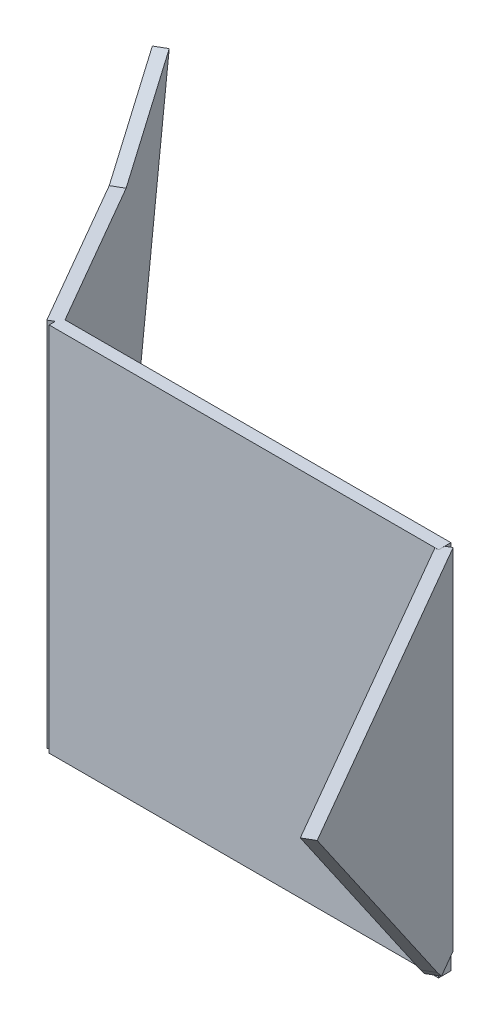
ISO-10303-21;
HEADER;
FILE_DESCRIPTION(('STEP AP214'),'2;1');
FILE_NAME('part.step','',(''),(''),'','','');
FILE_SCHEMA(('AUTOMOTIVE_DESIGN { 1 0 10303 214 1 1 1 1 }'));
ENDSEC;
DATA;
#1=APPLICATION_CONTEXT('core data for automotive mechanical design processes');
#2=APPLICATION_PROTOCOL_DEFINITION('international standard','automotive_design',2000,#1);
#3=PRODUCT_CONTEXT('',#1,'mechanical');
#4=PRODUCT('Part','Part','',(#3));
#5=PRODUCT_RELATED_PRODUCT_CATEGORY('part','',(#4));
#6=PRODUCT_DEFINITION_FORMATION('','',#4);
#7=PRODUCT_DEFINITION_CONTEXT('part definition',#1,'design');
#8=PRODUCT_DEFINITION('design','',#6,#7);
#9=PRODUCT_DEFINITION_SHAPE('','',#8);
#10=(LENGTH_UNIT() NAMED_UNIT(*) SI_UNIT(.MILLI.,.METRE.));
#11=(NAMED_UNIT(*) PLANE_ANGLE_UNIT() SI_UNIT($,.RADIAN.));
#12=(NAMED_UNIT(*) SI_UNIT($,.STERADIAN.) SOLID_ANGLE_UNIT());
#13=UNCERTAINTY_MEASURE_WITH_UNIT(LENGTH_MEASURE(1.E-05),#10,'distance_accuracy_value','');
#14=(GEOMETRIC_REPRESENTATION_CONTEXT(3) GLOBAL_UNCERTAINTY_ASSIGNED_CONTEXT((#13)) GLOBAL_UNIT_ASSIGNED_CONTEXT((#10,
#11,#12)) REPRESENTATION_CONTEXT('',''));
#15=CARTESIAN_POINT('',(0.,0.,0.));
#16=DIRECTION('',(0.,0.,1.));
#17=DIRECTION('',(1.,0.,0.));
#18=AXIS2_PLACEMENT_3D('',#15,#16,#17);
#19=CARTESIAN_POINT('',(-31.5,-30.,1.));
#20=DIRECTION('',(1.,0.,0.));
#21=DIRECTION('',(0.,0.,-1.));
#22=AXIS2_PLACEMENT_3D('',#19,#20,#21);
#23=PLANE('',#22);
#24=DIRECTION('',(0.,-0.361765106228722,0.932269278650391));
#25=VECTOR('',#24,1.);
#26=CARTESIAN_POINT('',(-31.5,-30.3372624946247,0.869126007915318));
#27=LINE('',#26,#25);
#28=CARTESIAN_POINT('',(-31.5,-29.6119521317356,-1.));
#29=VERTEX_POINT('',#28);
#30=CARTESIAN_POINT('',(-31.5,-30.,0.));
#31=VERTEX_POINT('',#30);
#32=EDGE_CURVE('E193',#29,#31,#27,.T.);
#33=ORIENTED_EDGE('',*,*,#32,.F.);
#34=DIRECTION('',(0.,-1.,0.));
#35=VECTOR('',#34,1.);
#36=CARTESIAN_POINT('',(-31.5,-30.,-1.));
#37=LINE('',#36,#35);
#38=CARTESIAN_POINT('',(-31.5,-30.,-1.));
#39=VERTEX_POINT('',#38);
#40=EDGE_CURVE('E285',#29,#39,#37,.T.);
#41=ORIENTED_EDGE('',*,*,#40,.T.);
#42=DIRECTION('',(0.,0.,-1.));
#43=VECTOR('',#42,1.);
#44=CARTESIAN_POINT('',(-31.5,-30.,1.));
#45=LINE('',#44,#43);
#46=EDGE_CURVE('E295',#31,#39,#45,.T.);
#47=ORIENTED_EDGE('',*,*,#46,.F.);
#48=EDGE_LOOP('',(#33,#41,#47));
#49=FACE_BOUND('',#48,.T.);
#50=ADVANCED_FACE('F47',(#49),#23,.F.);
#51=DIRECTION('',(0.,1.,0.));
#52=VECTOR('',#51,1.);
#53=CARTESIAN_POINT('',(-31.5,-30.,0.));
#54=LINE('',#53,#52);
#55=CARTESIAN_POINT('',(-31.5,30.,0.));
#56=VERTEX_POINT('',#55);
#57=EDGE_CURVE('E67',#31,#56,#54,.T.);
#58=ORIENTED_EDGE('',*,*,#57,.F.);
#59=CARTESIAN_POINT('',(-31.5,-30.,1.));
#60=VERTEX_POINT('',#59);
#61=EDGE_CURVE('E296',#60,#31,#45,.T.);
#62=ORIENTED_EDGE('',*,*,#61,.F.);
#63=DIRECTION('',(0.,-1.,0.));
#64=VECTOR('',#63,1.);
#65=CARTESIAN_POINT('',(-31.5,-30.,1.));
#66=LINE('',#65,#64);
#67=CARTESIAN_POINT('',(-31.5,30.,1.));
#68=VERTEX_POINT('',#67);
#69=EDGE_CURVE('E271',#68,#60,#66,.T.);
#70=ORIENTED_EDGE('',*,*,#69,.F.);
#71=DIRECTION('',(0.,0.,-1.));
#72=VECTOR('',#71,1.);
#73=CARTESIAN_POINT('',(-31.5,30.,1.));
#74=LINE('',#73,#72);
#75=EDGE_CURVE('E63',#68,#56,#74,.T.);
#76=ORIENTED_EDGE('',*,*,#75,.T.);
#77=EDGE_LOOP('',(#58,#62,#70,#76));
#78=FACE_BOUND('',#77,.T.);
#79=ADVANCED_FACE('F384',(#78),#23,.F.);
#80=CARTESIAN_POINT('',(0.,0.,-1.));
#81=DIRECTION('',(0.,0.,-1.));
#82=DIRECTION('',(-1.,0.,0.));
#83=AXIS2_PLACEMENT_3D('',#80,#81,#82);
#84=PLANE('',#83);
#85=ORIENTED_EDGE('',*,*,#40,.F.);
#86=DIRECTION('',(0.975810062793616,-0.218620038767537,0.));
#87=VECTOR('',#86,1.);
#88=CARTESIAN_POINT('',(-7.82269984956542,-34.9166035943157,-1.));
#89=LINE('',#88,#87);
#90=CARTESIAN_POINT('',(-30.9226497308104,-29.741301421157,-0.999999999999999));
#91=VERTEX_POINT('',#90);
#92=EDGE_CURVE('E11',#29,#91,#89,.T.);
#93=ORIENTED_EDGE('',*,*,#92,.T.);
#94=DIRECTION('',(0.,-1.,0.));
#95=VECTOR('',#94,1.);
#96=CARTESIAN_POINT('',(-30.9226497308104,0.,-1.));
#97=LINE('',#96,#95);
#98=CARTESIAN_POINT('',(-30.9226497308104,30.,-1.));
#99=VERTEX_POINT('',#98);
#100=EDGE_CURVE('E56',#99,#91,#97,.T.);
#101=ORIENTED_EDGE('',*,*,#100,.F.);
#102=DIRECTION('',(-1.,0.,0.));
#103=VECTOR('',#102,1.);
#104=CARTESIAN_POINT('',(-31.5,30.,-1.));
#105=LINE('',#104,#103);
#106=CARTESIAN_POINT('',(31.5,30.,-1.));
#107=VERTEX_POINT('',#106);
#108=EDGE_CURVE('E281',#107,#99,#105,.T.);
#109=ORIENTED_EDGE('',*,*,#108,.F.);
#110=DIRECTION('',(0.,1.,0.));
#111=VECTOR('',#110,1.);
#112=CARTESIAN_POINT('',(31.5,-30.,-1.));
#113=LINE('',#112,#111);
#114=CARTESIAN_POINT('',(31.5,-30.,-1.));
#115=VERTEX_POINT('',#114);
#116=EDGE_CURVE('E262',#115,#107,#113,.T.);
#117=ORIENTED_EDGE('',*,*,#116,.F.);
#118=DIRECTION('',(1.,0.,0.));
#119=VECTOR('',#118,1.);
#120=CARTESIAN_POINT('',(-31.5,-30.,-1.));
#121=LINE('',#120,#119);
#122=EDGE_CURVE('E289',#39,#115,#121,.T.);
#123=ORIENTED_EDGE('',*,*,#122,.F.);
#124=EDGE_LOOP('',(#85,#93,#101,#109,#117,#123));
#125=FACE_BOUND('',#124,.T.);
#126=ADVANCED_FACE('F340',(#125),#84,.T.);
#127=CARTESIAN_POINT('',(31.5,-30.,1.));
#128=DIRECTION('',(-1.,0.,0.));
#129=DIRECTION('',(0.,0.,1.));
#130=AXIS2_PLACEMENT_3D('',#127,#128,#129);
#131=PLANE('',#130);
#132=DIRECTION('',(0.,1.,0.));
#133=VECTOR('',#132,1.);
#134=CARTESIAN_POINT('',(31.5,-30.,0.));
#135=LINE('',#134,#133);
#136=CARTESIAN_POINT('',(31.5,-26.5343810519077,0.));
#137=VERTEX_POINT('',#136);
#138=CARTESIAN_POINT('',(31.5,29.9956189480923,0.));
#139=VERTEX_POINT('',#138);
#140=EDGE_CURVE('E318',#137,#139,#135,.T.);
#141=ORIENTED_EDGE('',*,*,#140,.F.);
#142=DIRECTION('',(0.,0.,1.));
#143=VECTOR('',#142,1.);
#144=CARTESIAN_POINT('',(31.5,-26.5343810519077,1.));
#145=LINE('',#144,#143);
#146=CARTESIAN_POINT('',(31.5,-26.5343810519077,1.));
#147=VERTEX_POINT('',#146);
#148=EDGE_CURVE('E258',#137,#147,#145,.T.);
#149=ORIENTED_EDGE('',*,*,#148,.T.);
#150=DIRECTION('',(0.,1.,0.));
#151=VECTOR('',#150,1.);
#152=CARTESIAN_POINT('',(31.5,-30.,1.));
#153=LINE('',#152,#151);
#154=CARTESIAN_POINT('',(31.5,-30.,1.));
#155=VERTEX_POINT('',#154);
#156=EDGE_CURVE('E263',#155,#147,#153,.T.);
#157=ORIENTED_EDGE('',*,*,#156,.F.);
#158=DIRECTION('',(0.,0.,-1.));
#159=VECTOR('',#158,1.);
#160=CARTESIAN_POINT('',(31.5,-30.,1.));
#161=LINE('',#160,#159);
#162=EDGE_CURVE('E277',#155,#115,#161,.T.);
#163=ORIENTED_EDGE('',*,*,#162,.T.);
#164=ORIENTED_EDGE('',*,*,#116,.T.);
#165=DIRECTION('',(0.,0.,-1.));
#166=VECTOR('',#165,1.);
#167=CARTESIAN_POINT('',(31.5,30.,1.));
#168=LINE('',#167,#166);
#169=CARTESIAN_POINT('',(31.5,30.,1.));
#170=VERTEX_POINT('',#169);
#171=EDGE_CURVE('E302',#170,#107,#168,.T.);
#172=ORIENTED_EDGE('',*,*,#171,.F.);
#173=CARTESIAN_POINT('',(31.5,29.9956189480923,1.));
#174=VERTEX_POINT('',#173);
#175=EDGE_CURVE('E268',#174,#170,#153,.T.);
#176=ORIENTED_EDGE('',*,*,#175,.F.);
#177=DIRECTION('',(0.,0.,-1.));
#178=VECTOR('',#177,1.);
#179=CARTESIAN_POINT('',(31.5,29.9956189480923,1.));
#180=LINE('',#179,#178);
#181=EDGE_CURVE('E254',#174,#139,#180,.T.);
#182=ORIENTED_EDGE('',*,*,#181,.T.);
#183=EDGE_LOOP('',(#141,#149,#157,#163,#164,#172,#176,#182));
#184=FACE_BOUND('',#183,.T.);
#185=ADVANCED_FACE('F49',(#184),#131,.F.);
#186=CARTESIAN_POINT('',(-31.5,30.,1.));
#187=DIRECTION('',(0.,-1.,0.));
#188=DIRECTION('',(0.,0.,-1.));
#189=AXIS2_PLACEMENT_3D('',#186,#187,#188);
#190=PLANE('',#189);
#191=DIRECTION('',(-0.866025403784445,0.,0.499999999999989));
#192=VECTOR('',#191,1.);
#193=CARTESIAN_POINT('',(-30.6339745962156,30.,-0.499999999999989));
#194=LINE('',#193,#192);
#195=CARTESIAN_POINT('',(-32.3660254037844,30.,0.499999999999989));
#196=VERTEX_POINT('',#195);
#197=EDGE_CURVE('E350',#56,#196,#194,.T.);
#198=ORIENTED_EDGE('',*,*,#197,.F.);
#199=ORIENTED_EDGE('',*,*,#75,.F.);
#200=DIRECTION('',(-1.,0.,0.));
#201=VECTOR('',#200,1.);
#202=CARTESIAN_POINT('',(-31.5,30.,1.));
#203=LINE('',#202,#201);
#204=EDGE_CURVE('E267',#170,#68,#203,.T.);
#205=ORIENTED_EDGE('',*,*,#204,.F.);
#206=ORIENTED_EDGE('',*,*,#171,.T.);
#207=ORIENTED_EDGE('',*,*,#108,.T.);
#208=DIRECTION('',(0.499999999999989,0.,0.866025403784445));
#209=VECTOR('',#208,1.);
#210=CARTESIAN_POINT('',(-44.422160736716,30.,-24.3818389395645));
#211=LINE('',#210,#209);
#212=CARTESIAN_POINT('',(-44.422160736716,30.,-24.3818389395645));
#213=VERTEX_POINT('',#212);
#214=EDGE_CURVE('E343',#213,#99,#211,.T.);
#215=ORIENTED_EDGE('',*,*,#214,.F.);
#216=DIRECTION('',(-0.866025403784445,0.,0.499999999999989));
#217=VECTOR('',#216,1.);
#218=CARTESIAN_POINT('',(-44.422160736716,30.,-24.3818389395645));
#219=LINE('',#218,#217);
#220=CARTESIAN_POINT('',(-46.1542115442849,30.,-23.3818389395645));
#221=VERTEX_POINT('',#220);
#222=EDGE_CURVE('E199',#213,#221,#219,.T.);
#223=ORIENTED_EDGE('',*,*,#222,.T.);
#224=DIRECTION('',(0.499999999999989,0.,0.866025403784445));
#225=VECTOR('',#224,1.);
#226=CARTESIAN_POINT('',(-46.1542115442849,30.,-23.3818389395645));
#227=LINE('',#226,#225);
#228=EDGE_CURVE('E362',#221,#196,#227,.T.);
#229=ORIENTED_EDGE('',*,*,#228,.T.);
#230=EDGE_LOOP('',(#198,#199,#205,#206,#207,#215,#223,#229));
#231=FACE_BOUND('',#230,.T.);
#232=ADVANCED_FACE('F332',(#231),#190,.F.);
#233=CARTESIAN_POINT('',(-31.5,-30.,1.));
#234=DIRECTION('',(0.,1.,0.));
#235=DIRECTION('',(0.,0.,1.));
#236=AXIS2_PLACEMENT_3D('',#233,#234,#235);
#237=PLANE('',#236);
#238=ORIENTED_EDGE('',*,*,#61,.T.);
#239=ORIENTED_EDGE('',*,*,#46,.T.);
#240=ORIENTED_EDGE('',*,*,#122,.T.);
#241=ORIENTED_EDGE('',*,*,#162,.F.);
#242=DIRECTION('',(1.,0.,0.));
#243=VECTOR('',#242,1.);
#244=CARTESIAN_POINT('',(-31.5,-30.,1.));
#245=LINE('',#244,#243);
#246=EDGE_CURVE('E274',#60,#155,#245,.T.);
#247=ORIENTED_EDGE('',*,*,#246,.F.);
#248=EDGE_LOOP('',(#238,#239,#240,#241,#247));
#249=FACE_BOUND('',#248,.T.);
#250=ADVANCED_FACE('F383',(#249),#237,.F.);
#251=CARTESIAN_POINT('',(0.,0.,1.));
#252=DIRECTION('',(0.,0.,-1.));
#253=DIRECTION('',(-1.,0.,0.));
#254=AXIS2_PLACEMENT_3D('',#251,#252,#253);
#255=PLANE('',#254);
#256=ORIENTED_EDGE('',*,*,#156,.T.);
#257=DIRECTION('',(-1.,0.,0.));
#258=VECTOR('',#257,1.);
#259=CARTESIAN_POINT('',(0.,-26.5343810519077,1.));
#260=LINE('',#259,#258);
#261=CARTESIAN_POINT('',(30.9226497308104,-26.5343810519077,1.00000000000001));
#262=VERTEX_POINT('',#261);
#263=EDGE_CURVE('E314',#147,#262,#260,.T.);
#264=ORIENTED_EDGE('',*,*,#263,.T.);
#265=DIRECTION('',(0.,1.,0.));
#266=VECTOR('',#265,1.);
#267=CARTESIAN_POINT('',(30.9226497308104,0.,1.));
#268=LINE('',#267,#266);
#269=CARTESIAN_POINT('',(30.9226497308104,29.9956189480923,1.));
#270=VERTEX_POINT('',#269);
#271=EDGE_CURVE('E306',#262,#270,#268,.T.);
#272=ORIENTED_EDGE('',*,*,#271,.T.);
#273=DIRECTION('',(1.,0.,0.));
#274=VECTOR('',#273,1.);
#275=CARTESIAN_POINT('',(0.,29.9956189480923,1.));
#276=LINE('',#275,#274);
#277=EDGE_CURVE('E310',#270,#174,#276,.T.);
#278=ORIENTED_EDGE('',*,*,#277,.T.);
#279=ORIENTED_EDGE('',*,*,#175,.T.);
#280=ORIENTED_EDGE('',*,*,#204,.T.);
#281=ORIENTED_EDGE('',*,*,#69,.T.);
#282=ORIENTED_EDGE('',*,*,#246,.T.);
#283=EDGE_LOOP('',(#256,#264,#272,#278,#279,#280,#281,#282));
#284=FACE_BOUND('',#283,.T.);
#285=ADVANCED_FACE('F326',(#284),#255,.F.);
#286=CARTESIAN_POINT('',(30.6339745962156,0.,0.499999999999993));
#287=DIRECTION('',(0.499999999999995,0.,0.866025403784442));
#288=DIRECTION('',(0.866025403784442,0.,-0.499999999999995));
#289=AXIS2_PLACEMENT_3D('',#286,#287,#288);
#290=PLANE('',#289);
#291=DIRECTION('',(0.866025403784442,0.,-0.499999999999995));
#292=VECTOR('',#291,1.);
#293=CARTESIAN_POINT('',(30.6339745962156,-26.5343810519077,0.499999999999995));
#294=LINE('',#293,#292);
#295=CARTESIAN_POINT('',(32.3660254037844,-26.5343810519077,-0.499999999999995));
#296=VERTEX_POINT('',#295);
#297=EDGE_CURVE('E221',#137,#296,#294,.T.);
#298=ORIENTED_EDGE('',*,*,#297,.F.);
#299=ORIENTED_EDGE('',*,*,#140,.T.);
#300=DIRECTION('',(0.866025403784442,0.,-0.499999999999995));
#301=VECTOR('',#300,1.);
#302=CARTESIAN_POINT('',(30.6339745962156,29.9956189480923,0.499999999999992));
#303=LINE('',#302,#301);
#304=CARTESIAN_POINT('',(32.3660254037844,29.9956189480923,-0.499999999999998));
#305=VERTEX_POINT('',#304);
#306=EDGE_CURVE('E241',#139,#305,#303,.T.);
#307=ORIENTED_EDGE('',*,*,#306,.T.);
#308=DIRECTION('',(0.,-1.,0.));
#309=VECTOR('',#308,1.);
#310=CARTESIAN_POINT('',(32.3660254037844,0.,-0.499999999999997));
#311=LINE('',#310,#309);
#312=EDGE_CURVE('E211',#305,#296,#311,.T.);
#313=ORIENTED_EDGE('',*,*,#312,.T.);
#314=EDGE_LOOP('',(#298,#299,#307,#313));
#315=FACE_BOUND('',#314,.T.);
#316=ADVANCED_FACE('F390',(#315),#290,.F.);
#317=CARTESIAN_POINT('',(22.7589745962157,-26.5343810519077,-13.1399001096048));
#318=DIRECTION('',(0.,-1.,0.));
#319=DIRECTION('',(0.,0.,-1.));
#320=AXIS2_PLACEMENT_3D('',#317,#318,#319);
#321=PLANE('',#320);
#322=ORIENTED_EDGE('',*,*,#148,.F.);
#323=ORIENTED_EDGE('',*,*,#297,.T.);
#324=DIRECTION('',(-0.499999999999995,0.,-0.866025403784442));
#325=VECTOR('',#324,1.);
#326=CARTESIAN_POINT('',(24.4910254037846,-26.5343810519077,-14.1399001096048));
#327=LINE('',#326,#325);
#328=CARTESIAN_POINT('',(34.9503480737994,-26.5343810519077,3.97617816761801));
#329=VERTEX_POINT('',#328);
#330=EDGE_CURVE('E205',#329,#296,#327,.T.);
#331=ORIENTED_EDGE('',*,*,#330,.F.);
#332=DIRECTION('',(0.866025403784442,0.,-0.499999999999995));
#333=VECTOR('',#332,1.);
#334=CARTESIAN_POINT('',(33.2182972662305,-26.5343810519077,4.976178167618));
#335=LINE('',#334,#333);
#336=CARTESIAN_POINT('',(33.2182972662305,-26.5343810519077,4.976178167618));
#337=VERTEX_POINT('',#336);
#338=EDGE_CURVE('E251',#337,#329,#335,.T.);
#339=ORIENTED_EDGE('',*,*,#338,.F.);
#340=DIRECTION('',(-0.499999999999995,0.,-0.866025403784442));
#341=VECTOR('',#340,1.);
#342=CARTESIAN_POINT('',(22.7589745962157,-26.5343810519077,-13.1399001096048));
#343=LINE('',#342,#341);
#344=EDGE_CURVE('E206',#337,#262,#343,.T.);
#345=ORIENTED_EDGE('',*,*,#344,.T.);
#346=ORIENTED_EDGE('',*,*,#263,.F.);
#347=EDGE_LOOP('',(#322,#323,#331,#339,#345,#346));
#348=FACE_BOUND('',#347,.T.);
#349=ADVANCED_FACE('F387',(#348),#321,.T.);
#350=CARTESIAN_POINT('',(22.7589745962157,29.9956189480923,-13.1399001096048));
#351=DIRECTION('',(0.,1.,0.));
#352=DIRECTION('',(0.,0.,1.));
#353=AXIS2_PLACEMENT_3D('',#350,#351,#352);
#354=PLANE('',#353);
#355=ORIENTED_EDGE('',*,*,#181,.F.);
#356=ORIENTED_EDGE('',*,*,#277,.F.);
#357=DIRECTION('',(0.499999999999995,0.,0.866025403784442));
#358=VECTOR('',#357,1.);
#359=CARTESIAN_POINT('',(22.7589745962157,29.9956189480923,-13.1399001096048));
#360=LINE('',#359,#358);
#361=CARTESIAN_POINT('',(60.6835654568077,29.9956189480923,52.5474181172037));
#362=VERTEX_POINT('',#361);
#363=EDGE_CURVE('E218',#270,#362,#360,.T.);
#364=ORIENTED_EDGE('',*,*,#363,.T.);
#365=DIRECTION('',(0.866025403784442,0.,-0.499999999999995));
#366=VECTOR('',#365,1.);
#367=CARTESIAN_POINT('',(60.6835654568077,29.9956189480923,52.5474181172037));
#368=LINE('',#367,#366);
#369=CARTESIAN_POINT('',(62.4156162643766,29.9956189480923,51.5474181172037));
#370=VERTEX_POINT('',#369);
#371=EDGE_CURVE('E244',#362,#370,#368,.T.);
#372=ORIENTED_EDGE('',*,*,#371,.T.);
#373=DIRECTION('',(0.499999999999995,0.,0.866025403784442));
#374=VECTOR('',#373,1.);
#375=CARTESIAN_POINT('',(24.4910254037846,29.9956189480923,-14.1399001096048));
#376=LINE('',#375,#374);
#377=EDGE_CURVE('E232',#305,#370,#376,.T.);
#378=ORIENTED_EDGE('',*,*,#377,.F.);
#379=ORIENTED_EDGE('',*,*,#306,.F.);
#380=EDGE_LOOP('',(#355,#356,#364,#372,#378,#379));
#381=FACE_BOUND('',#380,.T.);
#382=ADVANCED_FACE('F408',(#381),#354,.T.);
#383=CARTESIAN_POINT('',(22.7589745962157,0.,-13.1399001096048));
#384=DIRECTION('',(-0.866025403784441,0.,0.499999999999995));
#385=DIRECTION('',(0.499999999999995,0.,0.866025403784442));
#386=AXIS2_PLACEMENT_3D('',#383,#384,#385);
#387=PLANE('',#386);
#388=ORIENTED_EDGE('',*,*,#271,.F.);
#389=ORIENTED_EDGE('',*,*,#344,.F.);
#390=DIRECTION('',(0.359428390017677,0.695158204869361,0.622548233193307));
#391=VECTOR('',#390,1.);
#392=CARTESIAN_POINT('',(34.4432589324673,-24.1652244227024,7.09787401086442));
#393=LINE('',#392,#391);
#394=CARTESIAN_POINT('',(34.1282972662305,-24.7743810519077,6.55234440250568));
#395=VERTEX_POINT('',#394);
#396=EDGE_CURVE('E210',#337,#395,#393,.T.);
#397=ORIENTED_EDGE('',*,*,#396,.T.);
#398=DIRECTION('',(0.348073706221283,0.717898864847626,0.602881343954073));
#399=VECTOR('',#398,1.);
#400=CARTESIAN_POINT('',(34.8091471590098,-23.3701343178922,7.73161100912729));
#401=LINE('',#400,#399);
#402=EDGE_CURVE('E214',#395,#362,#401,.T.);
#403=ORIENTED_EDGE('',*,*,#402,.T.);
#404=ORIENTED_EDGE('',*,*,#363,.F.);
#405=EDGE_LOOP('',(#388,#389,#397,#403,#404));
#406=FACE_BOUND('',#405,.T.);
#407=ADVANCED_FACE('F405',(#406),#387,.T.);
#408=CARTESIAN_POINT('',(34.4432589324673,-24.1652244227024,7.09787401086442));
#409=DIRECTION('',(-0.347579102434677,0.718856780035361,-0.602024665066056));
#410=DIRECTION('',(0.,0.642056459010888,0.766657357260986));
#411=AXIS2_PLACEMENT_3D('',#408,#409,#410);
#412=PLANE('',#411);
#413=DIRECTION('',(0.359428390017677,0.695158204869361,0.622548233193307));
#414=VECTOR('',#413,1.);
#415=CARTESIAN_POINT('',(36.1753097400362,-24.1652244227024,6.09787401086443));
#416=LINE('',#415,#414);
#417=CARTESIAN_POINT('',(35.8603480737994,-24.7743810519077,5.55234440250569));
#418=VERTEX_POINT('',#417);
#419=EDGE_CURVE('E225',#329,#418,#416,.T.);
#420=ORIENTED_EDGE('',*,*,#419,.T.);
#421=DIRECTION('',(0.866025403784442,0.,-0.499999999999995));
#422=VECTOR('',#421,1.);
#423=CARTESIAN_POINT('',(34.1282972662305,-24.7743810519077,6.55234440250568));
#424=LINE('',#423,#422);
#425=EDGE_CURVE('E247',#395,#418,#424,.T.);
#426=ORIENTED_EDGE('',*,*,#425,.F.);
#427=ORIENTED_EDGE('',*,*,#396,.F.);
#428=ORIENTED_EDGE('',*,*,#338,.T.);
#429=EDGE_LOOP('',(#420,#426,#427,#428));
#430=FACE_BOUND('',#429,.T.);
#431=ADVANCED_FACE('F402',(#430),#412,.F.);
#432=CARTESIAN_POINT('',(34.8091471590098,-23.3701343178922,7.73161100912729));
#433=DIRECTION('',(-0.35894943242381,0.696147412442573,-0.621718654306058));
#434=DIRECTION('',(0.,0.666110233030065,0.745853308266869));
#435=AXIS2_PLACEMENT_3D('',#432,#433,#434);
#436=PLANE('',#435);
#437=DIRECTION('',(0.348073706221283,0.717898864847626,0.602881343954073));
#438=VECTOR('',#437,1.);
#439=CARTESIAN_POINT('',(36.5411979665787,-23.3701343178922,6.73161100912731));
#440=LINE('',#439,#438);
#441=EDGE_CURVE('E228',#418,#370,#440,.T.);
#442=ORIENTED_EDGE('',*,*,#441,.T.);
#443=ORIENTED_EDGE('',*,*,#371,.F.);
#444=ORIENTED_EDGE('',*,*,#402,.F.);
#445=ORIENTED_EDGE('',*,*,#425,.T.);
#446=EDGE_LOOP('',(#442,#443,#444,#445));
#447=FACE_BOUND('',#446,.T.);
#448=ADVANCED_FACE('F410',(#447),#436,.F.);
#449=CARTESIAN_POINT('',(24.4910254037846,0.,-14.1399001096048));
#450=DIRECTION('',(-0.866025403784441,0.,0.499999999999995));
#451=DIRECTION('',(0.499999999999995,0.,0.866025403784442));
#452=AXIS2_PLACEMENT_3D('',#449,#450,#451);
#453=PLANE('',#452);
#454=ORIENTED_EDGE('',*,*,#330,.T.);
#455=ORIENTED_EDGE('',*,*,#312,.F.);
#456=ORIENTED_EDGE('',*,*,#377,.T.);
#457=ORIENTED_EDGE('',*,*,#441,.F.);
#458=ORIENTED_EDGE('',*,*,#419,.F.);
#459=EDGE_LOOP('',(#454,#455,#456,#457,#458));
#460=FACE_BOUND('',#459,.T.);
#461=ADVANCED_FACE('F396',(#460),#453,.F.);
#462=CARTESIAN_POINT('',(-30.6339745962156,-30.,-0.499999999999992));
#463=DIRECTION('',(-0.499999999999989,0.,-0.866025403784445));
#464=DIRECTION('',(-0.866025403784445,0.,0.499999999999989));
#465=AXIS2_PLACEMENT_3D('',#462,#463,#464);
#466=PLANE('',#465);
#467=DIRECTION('',(-0.866025403784445,0.,0.499999999999989));
#468=VECTOR('',#467,1.);
#469=CARTESIAN_POINT('',(-30.6339745962156,-30.,-0.499999999999992));
#470=LINE('',#469,#468);
#471=CARTESIAN_POINT('',(-32.3660254037844,-30.,0.499999999999985));
#472=VERTEX_POINT('',#471);
#473=EDGE_CURVE('E346',#31,#472,#470,.T.);
#474=ORIENTED_EDGE('',*,*,#473,.F.);
#475=ORIENTED_EDGE('',*,*,#57,.T.);
#476=ORIENTED_EDGE('',*,*,#197,.T.);
#477=DIRECTION('',(0.,-1.,0.));
#478=VECTOR('',#477,1.);
#479=CARTESIAN_POINT('',(-32.3660254037844,-30.,0.499999999999985));
#480=LINE('',#479,#478);
#481=EDGE_CURVE('E176',#196,#472,#480,.T.);
#482=ORIENTED_EDGE('',*,*,#481,.T.);
#483=EDGE_LOOP('',(#474,#475,#476,#482));
#484=FACE_BOUND('',#483,.T.);
#485=ADVANCED_FACE('F379',(#484),#466,.F.);
#486=CARTESIAN_POINT('',(-30.6339745962156,-30.,-0.499999999999992));
#487=DIRECTION('',(0.204453185037961,0.912576342292153,0.354123304255041));
#488=DIRECTION('',(0.,-0.361765106228722,0.932269278650391));
#489=AXIS2_PLACEMENT_3D('',#486,#487,#488);
#490=PLANE('',#489);
#491=ORIENTED_EDGE('',*,*,#92,.F.);
#492=ORIENTED_EDGE('',*,*,#32,.T.);
#493=ORIENTED_EDGE('',*,*,#473,.T.);
#494=DIRECTION('',(-0.456288171146067,0.408906370075932,-0.790314295317694));
#495=VECTOR('',#494,1.);
#496=CARTESIAN_POINT('',(-32.3660254037844,-30.,0.499999999999985));
#497=LINE('',#496,#495);
#498=CARTESIAN_POINT('',(-46.1542115442849,-17.6436044123562,-23.3818389395645));
#499=VERTEX_POINT('',#498);
#500=EDGE_CURVE('E191',#472,#499,#497,.T.);
#501=ORIENTED_EDGE('',*,*,#500,.T.);
#502=DIRECTION('',(-0.866025403784445,0.,0.499999999999989));
#503=VECTOR('',#502,1.);
#504=CARTESIAN_POINT('',(-44.422160736716,-17.6436044123562,-24.3818389395645));
#505=LINE('',#504,#503);
#506=CARTESIAN_POINT('',(-44.422160736716,-17.6436044123562,-24.3818389395645));
#507=VERTEX_POINT('',#506);
#508=EDGE_CURVE('E181',#507,#499,#505,.T.);
#509=ORIENTED_EDGE('',*,*,#508,.F.);
#510=DIRECTION('',(-0.456288171146067,0.408906370075932,-0.790314295317694));
#511=VECTOR('',#510,1.);
#512=CARTESIAN_POINT('',(-30.6339745962156,-30.,-0.499999999999992));
#513=LINE('',#512,#511);
#514=EDGE_CURVE('E166',#91,#507,#513,.T.);
#515=ORIENTED_EDGE('',*,*,#514,.F.);
#516=EDGE_LOOP('',(#491,#492,#493,#501,#509,#515));
#517=FACE_BOUND('',#516,.T.);
#518=ADVANCED_FACE('F189',(#517),#490,.F.);
#519=CARTESIAN_POINT('',(-44.422160736716,-17.6436044123562,-24.3818389395645));
#520=DIRECTION('',(0.471708896038001,0.331606498118482,0.817023774320067));
#521=DIRECTION('',(0.866025403784445,0.,-0.499999999999989));
#522=AXIS2_PLACEMENT_3D('',#519,#520,#521);
#523=PLANE('',#522);
#524=DIRECTION('',(-0.165803249059237,0.943417792076023,-0.287179651430604));
#525=VECTOR('',#524,1.);
#526=CARTESIAN_POINT('',(-46.1542115442849,-17.6436044123562,-23.3818389395645));
#527=LINE('',#526,#525);
#528=CARTESIAN_POINT('',(-55.6789852228946,36.5522029972283,-39.8792308815117));
#529=VERTEX_POINT('',#528);
#530=EDGE_CURVE('E356',#499,#529,#527,.T.);
#531=ORIENTED_EDGE('',*,*,#530,.T.);
#532=DIRECTION('',(-0.866025403784445,0.,0.499999999999989));
#533=VECTOR('',#532,1.);
#534=CARTESIAN_POINT('',(-53.9469344153257,36.5522029972283,-40.8792308815117));
#535=LINE('',#534,#533);
#536=CARTESIAN_POINT('',(-53.9469344153257,36.5522029972283,-40.8792308815117));
#537=VERTEX_POINT('',#536);
#538=EDGE_CURVE('E184',#537,#529,#535,.T.);
#539=ORIENTED_EDGE('',*,*,#538,.F.);
#540=DIRECTION('',(-0.165803249059237,0.943417792076023,-0.287179651430604));
#541=VECTOR('',#540,1.);
#542=CARTESIAN_POINT('',(-44.422160736716,-17.6436044123562,-24.3818389395645));
#543=LINE('',#542,#541);
#544=EDGE_CURVE('E170',#507,#537,#543,.T.);
#545=ORIENTED_EDGE('',*,*,#544,.F.);
#546=ORIENTED_EDGE('',*,*,#508,.T.);
#547=EDGE_LOOP('',(#531,#539,#545,#546));
#548=FACE_BOUND('',#547,.T.);
#549=ADVANCED_FACE('F180',(#548),#523,.F.);
#550=CARTESIAN_POINT('',(-53.9469344153257,36.5522029972283,-40.8792308815117));
#551=DIRECTION('',(-0.162626919065101,-0.945626744958902,-0.281678086499155));
#552=DIRECTION('',(0.,0.285478480794484,-0.958385119356135));
#553=AXIS2_PLACEMENT_3D('',#550,#551,#552);
#554=PLANE('',#553);
#555=DIRECTION('',(0.47281337247944,-0.325253838130209,0.818936783632403));
#556=VECTOR('',#555,1.);
#557=CARTESIAN_POINT('',(-55.6789852228946,36.5522029972283,-39.8792308815117));
#558=LINE('',#557,#556);
#559=EDGE_CURVE('E359',#529,#221,#558,.T.);
#560=ORIENTED_EDGE('',*,*,#559,.T.);
#561=ORIENTED_EDGE('',*,*,#222,.F.);
#562=DIRECTION('',(0.47281337247944,-0.325253838130209,0.818936783632403));
#563=VECTOR('',#562,1.);
#564=CARTESIAN_POINT('',(-53.9469344153257,36.5522029972283,-40.8792308815117));
#565=LINE('',#564,#563);
#566=EDGE_CURVE('E187',#537,#213,#565,.T.);
#567=ORIENTED_EDGE('',*,*,#566,.F.);
#568=ORIENTED_EDGE('',*,*,#538,.T.);
#569=EDGE_LOOP('',(#560,#561,#567,#568));
#570=FACE_BOUND('',#569,.T.);
#571=ADVANCED_FACE('F455',(#570),#554,.F.);
#572=CARTESIAN_POINT('',(-22.7589745962159,0.,13.1399001096047));
#573=DIRECTION('',(0.866025403784445,0.,-0.499999999999989));
#574=DIRECTION('',(-0.499999999999989,0.,-0.866025403784445));
#575=AXIS2_PLACEMENT_3D('',#572,#573,#574);
#576=PLANE('',#575);
#577=ORIENTED_EDGE('',*,*,#214,.T.);
#578=ORIENTED_EDGE('',*,*,#100,.T.);
#579=ORIENTED_EDGE('',*,*,#514,.T.);
#580=ORIENTED_EDGE('',*,*,#544,.T.);
#581=ORIENTED_EDGE('',*,*,#566,.T.);
#582=EDGE_LOOP('',(#577,#578,#579,#580,#581));
#583=FACE_BOUND('',#582,.T.);
#584=ADVANCED_FACE('F169',(#583),#576,.T.);
#585=CARTESIAN_POINT('',(-24.4910254037848,0.,14.1399001096047));
#586=DIRECTION('',(0.866025403784445,0.,-0.499999999999989));
#587=DIRECTION('',(-0.499999999999989,0.,-0.866025403784445));
#588=AXIS2_PLACEMENT_3D('',#585,#586,#587);
#589=PLANE('',#588);
#590=ORIENTED_EDGE('',*,*,#500,.F.);
#591=ORIENTED_EDGE('',*,*,#481,.F.);
#592=ORIENTED_EDGE('',*,*,#228,.F.);
#593=ORIENTED_EDGE('',*,*,#559,.F.);
#594=ORIENTED_EDGE('',*,*,#530,.F.);
#595=EDGE_LOOP('',(#590,#591,#592,#593,#594));
#596=FACE_BOUND('',#595,.T.);
#597=ADVANCED_FACE('F376',(#596),#589,.F.);
#598=CLOSED_SHELL('',(#50,#79,#126,#185,#232,#250,#285,#316,#349,#382,#407,#431,#448,#461,#485,
#518,#549,#571,#584,#597));
#599=MANIFOLD_SOLID_BREP('B2',#598);
#600=ADVANCED_BREP_SHAPE_REPRESENTATION('',(#18,#599),#14);
#601=SHAPE_DEFINITION_REPRESENTATION(#9,#600);
ENDSEC;
END-ISO-10303-21;
